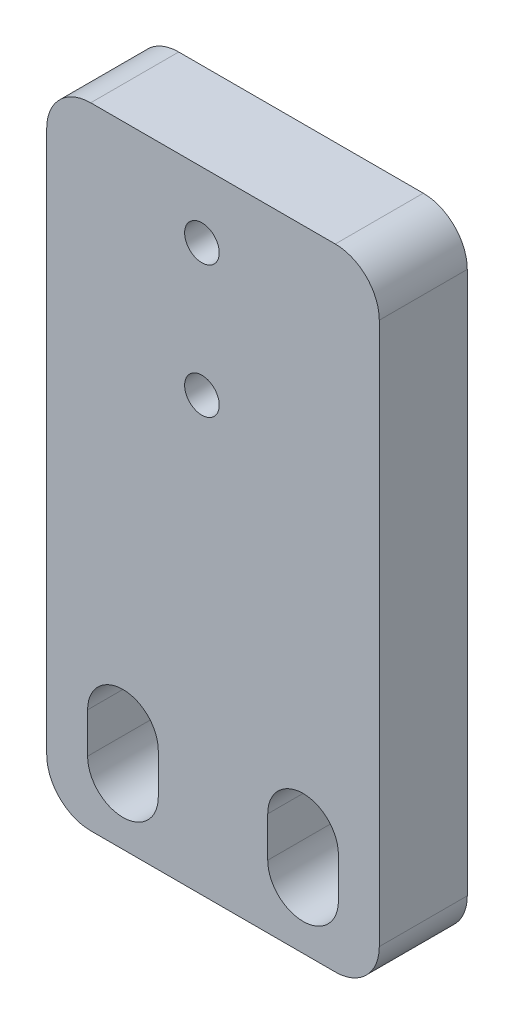
ISO-10303-21;
HEADER;
FILE_DESCRIPTION(('STEP AP214'),'2;1');
FILE_NAME('part.step','',(''),(''),'','','');
FILE_SCHEMA(('AUTOMOTIVE_DESIGN { 1 0 10303 214 1 1 1 1 }'));
ENDSEC;
DATA;
#1=APPLICATION_CONTEXT('core data for automotive mechanical design processes');
#2=APPLICATION_PROTOCOL_DEFINITION('international standard','automotive_design',2000,#1);
#3=PRODUCT_CONTEXT('',#1,'mechanical');
#4=PRODUCT('Part','Part','',(#3));
#5=PRODUCT_RELATED_PRODUCT_CATEGORY('part','',(#4));
#6=PRODUCT_DEFINITION_FORMATION('','',#4);
#7=PRODUCT_DEFINITION_CONTEXT('part definition',#1,'design');
#8=PRODUCT_DEFINITION('design','',#6,#7);
#9=PRODUCT_DEFINITION_SHAPE('','',#8);
#10=(LENGTH_UNIT() NAMED_UNIT(*) SI_UNIT(.MILLI.,.METRE.));
#11=(NAMED_UNIT(*) PLANE_ANGLE_UNIT() SI_UNIT($,.RADIAN.));
#12=(NAMED_UNIT(*) SI_UNIT($,.STERADIAN.) SOLID_ANGLE_UNIT());
#13=UNCERTAINTY_MEASURE_WITH_UNIT(LENGTH_MEASURE(1.E-05),#10,'distance_accuracy_value','');
#14=(GEOMETRIC_REPRESENTATION_CONTEXT(3) GLOBAL_UNCERTAINTY_ASSIGNED_CONTEXT((#13)) GLOBAL_UNIT_ASSIGNED_CONTEXT((#10,
#11,#12)) REPRESENTATION_CONTEXT('',''));
#15=CARTESIAN_POINT('',(0.,0.,0.));
#16=DIRECTION('',(0.,0.,1.));
#17=DIRECTION('',(1.,0.,0.));
#18=AXIS2_PLACEMENT_3D('',#15,#16,#17);
#19=CARTESIAN_POINT('',(203.92561380404,258.97885422312,6.35));
#20=DIRECTION('',(0.,0.,1.));
#21=DIRECTION('',(1.,0.,0.));
#22=AXIS2_PLACEMENT_3D('',#19,#20,#21);
#23=PLANE('',#22);
#24=CARTESIAN_POINT('',(211.95061380176,247.89135422392,6.35));
#25=DIRECTION('',(0.,0.,1.));
#26=DIRECTION('',(1.,0.,0.));
#27=AXIS2_PLACEMENT_3D('',#24,#25,#26);
#28=CIRCLE('',#27,1.24999999936001);
#29=CARTESIAN_POINT('',(213.20061380112,247.89135422392,6.35));
#30=VERTEX_POINT('',#29);
#31=EDGE_CURVE('E173',#30,#30,#28,.T.);
#32=ORIENTED_EDGE('',*,*,#31,.F.);
#33=EDGE_LOOP('',(#32));
#34=FACE_BOUND('',#33,.T.);
#35=DIRECTION('',(0.,1.,0.));
#36=VECTOR('',#35,1.);
#37=CARTESIAN_POINT('',(208.80061380256,224.10385422472,6.35));
#38=LINE('',#37,#36);
#39=CARTESIAN_POINT('',(208.80061380256,221.20385422336,6.35));
#40=VERTEX_POINT('',#39);
#41=CARTESIAN_POINT('',(208.80061380256,224.10385422472,6.35));
#42=VERTEX_POINT('',#41);
#43=EDGE_CURVE('E185',#40,#42,#38,.T.);
#44=ORIENTED_EDGE('',*,*,#43,.F.);
#45=CARTESIAN_POINT('',(206.25061380224,221.20385422336,6.35));
#46=DIRECTION('',(0.,0.,1.));
#47=DIRECTION('',(1.,0.,0.));
#48=AXIS2_PLACEMENT_3D('',#45,#46,#47);
#49=CIRCLE('',#48,2.55000000032);
#50=CARTESIAN_POINT('',(203.70061380192,221.20385422336,6.35));
#51=VERTEX_POINT('',#50);
#52=EDGE_CURVE('E183',#51,#40,#49,.T.);
#53=ORIENTED_EDGE('',*,*,#52,.F.);
#54=DIRECTION('',(0.,-1.,0.));
#55=VECTOR('',#54,1.);
#56=CARTESIAN_POINT('',(203.70061380192,221.20385422336,6.35));
#57=LINE('',#56,#55);
#58=CARTESIAN_POINT('',(203.70061380192,224.10385422472,6.35));
#59=VERTEX_POINT('',#58);
#60=EDGE_CURVE('E191',#59,#51,#57,.T.);
#61=ORIENTED_EDGE('',*,*,#60,.F.);
#62=CARTESIAN_POINT('',(206.25061380224,224.10385422472,6.35));
#63=DIRECTION('',(0.,0.,1.));
#64=DIRECTION('',(1.,0.,0.));
#65=AXIS2_PLACEMENT_3D('',#62,#63,#64);
#66=CIRCLE('',#65,2.55000000032);
#67=EDGE_CURVE('E188',#42,#59,#66,.T.);
#68=ORIENTED_EDGE('',*,*,#67,.F.);
#69=EDGE_LOOP('',(#44,#53,#61,#68));
#70=FACE_BOUND('',#69,.T.);
#71=CARTESIAN_POINT('',(203.92561380404,258.97885422312,6.35));
#72=DIRECTION('',(0.,0.,1.));
#73=DIRECTION('',(1.,0.,0.));
#74=AXIS2_PLACEMENT_3D('',#71,#72,#73);
#75=CIRCLE('',#74,3.175);
#76=CARTESIAN_POINT('',(203.92561380404,262.15385422312,6.35));
#77=VERTEX_POINT('',#76);
#78=CARTESIAN_POINT('',(200.75061380404,258.97885422312,6.35));
#79=VERTEX_POINT('',#78);
#80=EDGE_CURVE('E214',#77,#79,#75,.T.);
#81=ORIENTED_EDGE('',*,*,#80,.T.);
#82=DIRECTION('',(0.,-1.,0.));
#83=VECTOR('',#82,1.);
#84=CARTESIAN_POINT('',(200.75061380404,258.97885422312,6.35));
#85=LINE('',#84,#83);
#86=CARTESIAN_POINT('',(200.75061380404,219.82885422254,6.35));
#87=VERTEX_POINT('',#86);
#88=EDGE_CURVE('E217',#79,#87,#85,.T.);
#89=ORIENTED_EDGE('',*,*,#88,.T.);
#90=CARTESIAN_POINT('',(203.92561380404,219.82885422254,6.35));
#91=DIRECTION('',(0.,0.,1.));
#92=DIRECTION('',(1.,0.,0.));
#93=AXIS2_PLACEMENT_3D('',#90,#91,#92);
#94=CIRCLE('',#93,3.175);
#95=CARTESIAN_POINT('',(203.92561380404,216.65385422254,6.35));
#96=VERTEX_POINT('',#95);
#97=EDGE_CURVE('E220',#87,#96,#94,.T.);
#98=ORIENTED_EDGE('',*,*,#97,.T.);
#99=DIRECTION('',(1.,0.,0.));
#100=VECTOR('',#99,1.);
#101=CARTESIAN_POINT('',(203.92561380404,216.65385422254,6.35));
#102=LINE('',#101,#100);
#103=CARTESIAN_POINT('',(221.57561380242,216.65385422254,6.35));
#104=VERTEX_POINT('',#103);
#105=EDGE_CURVE('E222',#96,#104,#102,.T.);
#106=ORIENTED_EDGE('',*,*,#105,.T.);
#107=CARTESIAN_POINT('',(221.57561380242,219.82885422254,6.35));
#108=DIRECTION('',(0.,0.,1.));
#109=DIRECTION('',(1.,0.,0.));
#110=AXIS2_PLACEMENT_3D('',#107,#108,#109);
#111=CIRCLE('',#110,3.175);
#112=CARTESIAN_POINT('',(224.75061380242,219.82885422254,6.35));
#113=VERTEX_POINT('',#112);
#114=EDGE_CURVE('E224',#104,#113,#111,.T.);
#115=ORIENTED_EDGE('',*,*,#114,.T.);
#116=DIRECTION('',(0.,1.,0.));
#117=VECTOR('',#116,1.);
#118=CARTESIAN_POINT('',(224.75061380242,219.82885422254,6.35));
#119=LINE('',#118,#117);
#120=CARTESIAN_POINT('',(224.75061380242,258.97885422312,6.35));
#121=VERTEX_POINT('',#120);
#122=EDGE_CURVE('E226',#113,#121,#119,.T.);
#123=ORIENTED_EDGE('',*,*,#122,.T.);
#124=CARTESIAN_POINT('',(221.57561380242,258.97885422312,6.35));
#125=DIRECTION('',(0.,0.,1.));
#126=DIRECTION('',(1.,0.,0.));
#127=AXIS2_PLACEMENT_3D('',#124,#125,#126);
#128=CIRCLE('',#127,3.175);
#129=CARTESIAN_POINT('',(221.57561380242,262.15385422312,6.35));
#130=VERTEX_POINT('',#129);
#131=EDGE_CURVE('E228',#121,#130,#128,.T.);
#132=ORIENTED_EDGE('',*,*,#131,.T.);
#133=DIRECTION('',(-1.,0.,0.));
#134=VECTOR('',#133,1.);
#135=CARTESIAN_POINT('',(221.57561380242,262.15385422312,6.35));
#136=LINE('',#135,#134);
#137=EDGE_CURVE('E230',#130,#77,#136,.T.);
#138=ORIENTED_EDGE('',*,*,#137,.T.);
#139=EDGE_LOOP('',(#81,#89,#98,#106,#115,#123,#132,#138));
#140=FACE_BOUND('',#139,.T.);
#141=DIRECTION('',(0.,-1.,0.));
#142=VECTOR('',#141,1.);
#143=CARTESIAN_POINT('',(216.7006138039,224.10385422472,6.35));
#144=LINE('',#143,#142);
#145=CARTESIAN_POINT('',(216.7006138039,224.10385422472,6.35));
#146=VERTEX_POINT('',#145);
#147=CARTESIAN_POINT('',(216.7006138039,221.20385422336,6.35));
#148=VERTEX_POINT('',#147);
#149=EDGE_CURVE('E152',#146,#148,#144,.T.);
#150=ORIENTED_EDGE('',*,*,#149,.F.);
#151=CARTESIAN_POINT('',(219.25061380295,224.10385422472,6.35));
#152=DIRECTION('',(0.,0.,1.));
#153=DIRECTION('',(1.,0.,0.));
#154=AXIS2_PLACEMENT_3D('',#151,#152,#153);
#155=CIRCLE('',#154,2.54999999904999);
#156=CARTESIAN_POINT('',(221.800613802,224.10385422472,6.35));
#157=VERTEX_POINT('',#156);
#158=EDGE_CURVE('E144',#157,#146,#155,.T.);
#159=ORIENTED_EDGE('',*,*,#158,.F.);
#160=DIRECTION('',(0.,1.,0.));
#161=VECTOR('',#160,1.);
#162=CARTESIAN_POINT('',(221.800613802,221.20385422336,6.35));
#163=LINE('',#162,#161);
#164=CARTESIAN_POINT('',(221.800613802,221.20385422336,6.35));
#165=VERTEX_POINT('',#164);
#166=EDGE_CURVE('E167',#165,#157,#163,.T.);
#167=ORIENTED_EDGE('',*,*,#166,.F.);
#168=CARTESIAN_POINT('',(219.25061380295,221.20385422336,6.35));
#169=DIRECTION('',(0.,0.,1.));
#170=DIRECTION('',(1.,0.,0.));
#171=AXIS2_PLACEMENT_3D('',#168,#169,#170);
#172=CIRCLE('',#171,2.54999999904999);
#173=EDGE_CURVE('E165',#148,#165,#172,.T.);
#174=ORIENTED_EDGE('',*,*,#173,.F.);
#175=EDGE_LOOP('',(#150,#159,#167,#174));
#176=FACE_BOUND('',#175,.T.);
#177=CARTESIAN_POINT('',(211.95061380176,257.41635422392,6.35));
#178=DIRECTION('',(0.,0.,1.));
#179=DIRECTION('',(1.,0.,0.));
#180=AXIS2_PLACEMENT_3D('',#177,#178,#179);
#181=CIRCLE('',#180,1.24999999936001);
#182=CARTESIAN_POINT('',(213.20061380112,257.41635422392,6.35));
#183=VERTEX_POINT('',#182);
#184=EDGE_CURVE('E382',#183,#183,#181,.T.);
#185=ORIENTED_EDGE('',*,*,#184,.F.);
#186=EDGE_LOOP('',(#185));
#187=FACE_BOUND('',#186,.T.);
#188=ADVANCED_FACE('F31',(#34,#70,#140,#176,#187),#23,.T.);
#189=CARTESIAN_POINT('',(203.92561380404,258.97885422312,0.));
#190=DIRECTION('',(0.,0.,1.));
#191=DIRECTION('',(1.,0.,0.));
#192=AXIS2_PLACEMENT_3D('',#189,#190,#191);
#193=PLANE('',#192);
#194=CARTESIAN_POINT('',(211.95061380176,247.89135422392,0.));
#195=DIRECTION('',(0.,0.,1.));
#196=DIRECTION('',(1.,0.,0.));
#197=AXIS2_PLACEMENT_3D('',#194,#195,#196);
#198=CIRCLE('',#197,1.24999999936001);
#199=CARTESIAN_POINT('',(213.20061380112,247.89135422392,0.));
#200=VERTEX_POINT('',#199);
#201=EDGE_CURVE('E388',#200,#200,#198,.T.);
#202=ORIENTED_EDGE('',*,*,#201,.T.);
#203=EDGE_LOOP('',(#202));
#204=FACE_BOUND('',#203,.T.);
#205=CARTESIAN_POINT('',(206.25061380224,221.20385422336,0.));
#206=DIRECTION('',(0.,0.,1.));
#207=DIRECTION('',(1.,0.,0.));
#208=AXIS2_PLACEMENT_3D('',#205,#206,#207);
#209=CIRCLE('',#208,2.55000000032);
#210=CARTESIAN_POINT('',(203.70061380192,221.20385422336,0.));
#211=VERTEX_POINT('',#210);
#212=CARTESIAN_POINT('',(208.80061380256,221.20385422336,0.));
#213=VERTEX_POINT('',#212);
#214=EDGE_CURVE('E160',#211,#213,#209,.T.);
#215=ORIENTED_EDGE('',*,*,#214,.T.);
#216=DIRECTION('',(0.,1.,0.));
#217=VECTOR('',#216,1.);
#218=CARTESIAN_POINT('',(208.80061380256,224.10385422472,0.));
#219=LINE('',#218,#217);
#220=CARTESIAN_POINT('',(208.80061380256,224.10385422472,0.));
#221=VERTEX_POINT('',#220);
#222=EDGE_CURVE('E196',#213,#221,#219,.T.);
#223=ORIENTED_EDGE('',*,*,#222,.T.);
#224=CARTESIAN_POINT('',(206.25061380224,224.10385422472,0.));
#225=DIRECTION('',(0.,0.,1.));
#226=DIRECTION('',(1.,0.,0.));
#227=AXIS2_PLACEMENT_3D('',#224,#225,#226);
#228=CIRCLE('',#227,2.55000000032);
#229=CARTESIAN_POINT('',(203.70061380192,224.10385422472,0.));
#230=VERTEX_POINT('',#229);
#231=EDGE_CURVE('E199',#221,#230,#228,.T.);
#232=ORIENTED_EDGE('',*,*,#231,.T.);
#233=DIRECTION('',(0.,-1.,0.));
#234=VECTOR('',#233,1.);
#235=CARTESIAN_POINT('',(203.70061380192,221.20385422336,0.));
#236=LINE('',#235,#234);
#237=EDGE_CURVE('E186',#230,#211,#236,.T.);
#238=ORIENTED_EDGE('',*,*,#237,.T.);
#239=EDGE_LOOP('',(#215,#223,#232,#238));
#240=FACE_BOUND('',#239,.T.);
#241=CARTESIAN_POINT('',(203.92561380404,258.97885422312,0.));
#242=DIRECTION('',(0.,0.,1.));
#243=DIRECTION('',(1.,0.,0.));
#244=AXIS2_PLACEMENT_3D('',#241,#242,#243);
#245=CIRCLE('',#244,3.175);
#246=CARTESIAN_POINT('',(203.92561380404,262.15385422312,0.));
#247=VERTEX_POINT('',#246);
#248=CARTESIAN_POINT('',(200.75061380404,258.97885422312,0.));
#249=VERTEX_POINT('',#248);
#250=EDGE_CURVE('E213',#247,#249,#245,.T.);
#251=ORIENTED_EDGE('',*,*,#250,.F.);
#252=DIRECTION('',(-1.,0.,0.));
#253=VECTOR('',#252,1.);
#254=CARTESIAN_POINT('',(221.57561380242,262.15385422312,0.));
#255=LINE('',#254,#253);
#256=CARTESIAN_POINT('',(221.57561380242,262.15385422312,0.));
#257=VERTEX_POINT('',#256);
#258=EDGE_CURVE('E218',#257,#247,#255,.T.);
#259=ORIENTED_EDGE('',*,*,#258,.F.);
#260=CARTESIAN_POINT('',(221.57561380242,258.97885422312,0.));
#261=DIRECTION('',(0.,0.,1.));
#262=DIRECTION('',(1.,0.,0.));
#263=AXIS2_PLACEMENT_3D('',#260,#261,#262);
#264=CIRCLE('',#263,3.175);
#265=CARTESIAN_POINT('',(224.75061380242,258.97885422312,0.));
#266=VERTEX_POINT('',#265);
#267=EDGE_CURVE('E245',#266,#257,#264,.T.);
#268=ORIENTED_EDGE('',*,*,#267,.F.);
#269=DIRECTION('',(0.,1.,0.));
#270=VECTOR('',#269,1.);
#271=CARTESIAN_POINT('',(224.75061380242,219.82885422254,0.));
#272=LINE('',#271,#270);
#273=CARTESIAN_POINT('',(224.75061380242,219.82885422254,0.));
#274=VERTEX_POINT('',#273);
#275=EDGE_CURVE('E243',#274,#266,#272,.T.);
#276=ORIENTED_EDGE('',*,*,#275,.F.);
#277=CARTESIAN_POINT('',(221.57561380242,219.82885422254,0.));
#278=DIRECTION('',(0.,0.,1.));
#279=DIRECTION('',(1.,0.,0.));
#280=AXIS2_PLACEMENT_3D('',#277,#278,#279);
#281=CIRCLE('',#280,3.175);
#282=CARTESIAN_POINT('',(221.57561380242,216.65385422254,0.));
#283=VERTEX_POINT('',#282);
#284=EDGE_CURVE('E241',#283,#274,#281,.T.);
#285=ORIENTED_EDGE('',*,*,#284,.F.);
#286=DIRECTION('',(1.,0.,0.));
#287=VECTOR('',#286,1.);
#288=CARTESIAN_POINT('',(203.92561380404,216.65385422254,0.));
#289=LINE('',#288,#287);
#290=CARTESIAN_POINT('',(203.92561380404,216.65385422254,0.));
#291=VERTEX_POINT('',#290);
#292=EDGE_CURVE('E239',#291,#283,#289,.T.);
#293=ORIENTED_EDGE('',*,*,#292,.F.);
#294=CARTESIAN_POINT('',(203.92561380404,219.82885422254,0.));
#295=DIRECTION('',(0.,0.,1.));
#296=DIRECTION('',(1.,0.,0.));
#297=AXIS2_PLACEMENT_3D('',#294,#295,#296);
#298=CIRCLE('',#297,3.175);
#299=CARTESIAN_POINT('',(200.75061380404,219.82885422254,0.));
#300=VERTEX_POINT('',#299);
#301=EDGE_CURVE('E237',#300,#291,#298,.T.);
#302=ORIENTED_EDGE('',*,*,#301,.F.);
#303=DIRECTION('',(0.,-1.,0.));
#304=VECTOR('',#303,1.);
#305=CARTESIAN_POINT('',(200.75061380404,258.97885422312,0.));
#306=LINE('',#305,#304);
#307=EDGE_CURVE('E235',#249,#300,#306,.T.);
#308=ORIENTED_EDGE('',*,*,#307,.F.);
#309=EDGE_LOOP('',(#251,#259,#268,#276,#285,#293,#302,#308));
#310=FACE_BOUND('',#309,.T.);
#311=CARTESIAN_POINT('',(219.25061380295,224.10385422472,0.));
#312=DIRECTION('',(0.,0.,1.));
#313=DIRECTION('',(1.,0.,0.));
#314=AXIS2_PLACEMENT_3D('',#311,#312,#313);
#315=CIRCLE('',#314,2.54999999904999);
#316=CARTESIAN_POINT('',(221.800613802,224.10385422472,0.));
#317=VERTEX_POINT('',#316);
#318=CARTESIAN_POINT('',(216.7006138039,224.10385422472,0.));
#319=VERTEX_POINT('',#318);
#320=EDGE_CURVE('E54',#317,#319,#315,.T.);
#321=ORIENTED_EDGE('',*,*,#320,.T.);
#322=DIRECTION('',(0.,-1.,0.));
#323=VECTOR('',#322,1.);
#324=CARTESIAN_POINT('',(216.7006138039,224.10385422472,0.));
#325=LINE('',#324,#323);
#326=CARTESIAN_POINT('',(216.7006138039,221.20385422336,0.));
#327=VERTEX_POINT('',#326);
#328=EDGE_CURVE('E159',#319,#327,#325,.T.);
#329=ORIENTED_EDGE('',*,*,#328,.T.);
#330=CARTESIAN_POINT('',(219.25061380295,221.20385422336,0.));
#331=DIRECTION('',(0.,0.,1.));
#332=DIRECTION('',(1.,0.,0.));
#333=AXIS2_PLACEMENT_3D('',#330,#331,#332);
#334=CIRCLE('',#333,2.54999999904999);
#335=CARTESIAN_POINT('',(221.800613802,221.20385422336,0.));
#336=VERTEX_POINT('',#335);
#337=EDGE_CURVE('E175',#327,#336,#334,.T.);
#338=ORIENTED_EDGE('',*,*,#337,.T.);
#339=DIRECTION('',(0.,1.,0.));
#340=VECTOR('',#339,1.);
#341=CARTESIAN_POINT('',(221.800613802,221.20385422336,0.));
#342=LINE('',#341,#340);
#343=EDGE_CURVE('E153',#336,#317,#342,.T.);
#344=ORIENTED_EDGE('',*,*,#343,.T.);
#345=EDGE_LOOP('',(#321,#329,#338,#344));
#346=FACE_BOUND('',#345,.T.);
#347=CARTESIAN_POINT('',(211.95061380176,257.41635422392,0.));
#348=DIRECTION('',(0.,0.,1.));
#349=DIRECTION('',(1.,0.,0.));
#350=AXIS2_PLACEMENT_3D('',#347,#348,#349);
#351=CIRCLE('',#350,1.24999999936001);
#352=CARTESIAN_POINT('',(213.20061380112,257.41635422392,0.));
#353=VERTEX_POINT('',#352);
#354=EDGE_CURVE('E385',#353,#353,#351,.T.);
#355=ORIENTED_EDGE('',*,*,#354,.T.);
#356=EDGE_LOOP('',(#355));
#357=FACE_BOUND('',#356,.T.);
#358=ADVANCED_FACE('F275',(#204,#240,#310,#346,#357),#193,.F.);
#359=CARTESIAN_POINT('',(203.92561380404,258.97885422312,6.35));
#360=DIRECTION('',(0.,0.,-1.));
#361=DIRECTION('',(-1.,0.,0.));
#362=AXIS2_PLACEMENT_3D('',#359,#360,#361);
#363=CYLINDRICAL_SURFACE('',#362,3.175);
#364=ORIENTED_EDGE('',*,*,#250,.T.);
#365=DIRECTION('',(0.,0.,-1.));
#366=VECTOR('',#365,1.);
#367=CARTESIAN_POINT('',(200.75061380404,258.97885422312,6.35));
#368=LINE('',#367,#366);
#369=EDGE_CURVE('E11',#79,#249,#368,.T.);
#370=ORIENTED_EDGE('',*,*,#369,.F.);
#371=ORIENTED_EDGE('',*,*,#80,.F.);
#372=DIRECTION('',(0.,0.,-1.));
#373=VECTOR('',#372,1.);
#374=CARTESIAN_POINT('',(203.92561380404,262.15385422312,6.35));
#375=LINE('',#374,#373);
#376=EDGE_CURVE('E232',#77,#247,#375,.T.);
#377=ORIENTED_EDGE('',*,*,#376,.T.);
#378=EDGE_LOOP('',(#364,#370,#371,#377));
#379=FACE_BOUND('',#378,.T.);
#380=ADVANCED_FACE('F33',(#379),#363,.T.);
#381=CARTESIAN_POINT('',(200.75061380404,258.97885422312,6.35));
#382=DIRECTION('',(1.,0.,0.));
#383=DIRECTION('',(0.,0.,-1.));
#384=AXIS2_PLACEMENT_3D('',#381,#382,#383);
#385=PLANE('',#384);
#386=ORIENTED_EDGE('',*,*,#307,.T.);
#387=DIRECTION('',(0.,0.,-1.));
#388=VECTOR('',#387,1.);
#389=CARTESIAN_POINT('',(200.75061380404,219.82885422254,6.35));
#390=LINE('',#389,#388);
#391=EDGE_CURVE('E39',#87,#300,#390,.T.);
#392=ORIENTED_EDGE('',*,*,#391,.F.);
#393=ORIENTED_EDGE('',*,*,#88,.F.);
#394=ORIENTED_EDGE('',*,*,#369,.T.);
#395=EDGE_LOOP('',(#386,#392,#393,#394));
#396=FACE_BOUND('',#395,.T.);
#397=ADVANCED_FACE('F292',(#396),#385,.F.);
#398=CARTESIAN_POINT('',(203.92561380404,219.82885422254,6.35));
#399=DIRECTION('',(0.,0.,-1.));
#400=DIRECTION('',(-1.,0.,0.));
#401=AXIS2_PLACEMENT_3D('',#398,#399,#400);
#402=CYLINDRICAL_SURFACE('',#401,3.175);
#403=ORIENTED_EDGE('',*,*,#301,.T.);
#404=DIRECTION('',(0.,0.,-1.));
#405=VECTOR('',#404,1.);
#406=CARTESIAN_POINT('',(203.92561380404,216.65385422254,6.35));
#407=LINE('',#406,#405);
#408=EDGE_CURVE('E262',#96,#291,#407,.T.);
#409=ORIENTED_EDGE('',*,*,#408,.F.);
#410=ORIENTED_EDGE('',*,*,#97,.F.);
#411=ORIENTED_EDGE('',*,*,#391,.T.);
#412=EDGE_LOOP('',(#403,#409,#410,#411));
#413=FACE_BOUND('',#412,.T.);
#414=ADVANCED_FACE('F269',(#413),#402,.T.);
#415=CARTESIAN_POINT('',(203.92561380404,216.65385422254,6.35));
#416=DIRECTION('',(0.,1.,0.));
#417=DIRECTION('',(0.,0.,1.));
#418=AXIS2_PLACEMENT_3D('',#415,#416,#417);
#419=PLANE('',#418);
#420=ORIENTED_EDGE('',*,*,#292,.T.);
#421=DIRECTION('',(0.,0.,-1.));
#422=VECTOR('',#421,1.);
#423=CARTESIAN_POINT('',(221.57561380242,216.65385422254,6.35));
#424=LINE('',#423,#422);
#425=EDGE_CURVE('E259',#104,#283,#424,.T.);
#426=ORIENTED_EDGE('',*,*,#425,.F.);
#427=ORIENTED_EDGE('',*,*,#105,.F.);
#428=ORIENTED_EDGE('',*,*,#408,.T.);
#429=EDGE_LOOP('',(#420,#426,#427,#428));
#430=FACE_BOUND('',#429,.T.);
#431=ADVANCED_FACE('F281',(#430),#419,.F.);
#432=CARTESIAN_POINT('',(221.57561380242,219.82885422254,6.35));
#433=DIRECTION('',(0.,0.,-1.));
#434=DIRECTION('',(-1.,0.,0.));
#435=AXIS2_PLACEMENT_3D('',#432,#433,#434);
#436=CYLINDRICAL_SURFACE('',#435,3.175);
#437=ORIENTED_EDGE('',*,*,#284,.T.);
#438=DIRECTION('',(0.,0.,-1.));
#439=VECTOR('',#438,1.);
#440=CARTESIAN_POINT('',(224.75061380242,219.82885422254,6.35));
#441=LINE('',#440,#439);
#442=EDGE_CURVE('E256',#113,#274,#441,.T.);
#443=ORIENTED_EDGE('',*,*,#442,.F.);
#444=ORIENTED_EDGE('',*,*,#114,.F.);
#445=ORIENTED_EDGE('',*,*,#425,.T.);
#446=EDGE_LOOP('',(#437,#443,#444,#445));
#447=FACE_BOUND('',#446,.T.);
#448=ADVANCED_FACE('F285',(#447),#436,.T.);
#449=CARTESIAN_POINT('',(224.75061380242,219.82885422254,6.35));
#450=DIRECTION('',(-1.,0.,0.));
#451=DIRECTION('',(0.,0.,1.));
#452=AXIS2_PLACEMENT_3D('',#449,#450,#451);
#453=PLANE('',#452);
#454=ORIENTED_EDGE('',*,*,#275,.T.);
#455=DIRECTION('',(0.,0.,-1.));
#456=VECTOR('',#455,1.);
#457=CARTESIAN_POINT('',(224.75061380242,258.97885422312,6.35));
#458=LINE('',#457,#456);
#459=EDGE_CURVE('E253',#121,#266,#458,.T.);
#460=ORIENTED_EDGE('',*,*,#459,.F.);
#461=ORIENTED_EDGE('',*,*,#122,.F.);
#462=ORIENTED_EDGE('',*,*,#442,.T.);
#463=EDGE_LOOP('',(#454,#460,#461,#462));
#464=FACE_BOUND('',#463,.T.);
#465=ADVANCED_FACE('F305',(#464),#453,.F.);
#466=CARTESIAN_POINT('',(221.57561380242,258.97885422312,6.35));
#467=DIRECTION('',(0.,0.,-1.));
#468=DIRECTION('',(-1.,0.,0.));
#469=AXIS2_PLACEMENT_3D('',#466,#467,#468);
#470=CYLINDRICAL_SURFACE('',#469,3.175);
#471=ORIENTED_EDGE('',*,*,#267,.T.);
#472=DIRECTION('',(0.,0.,-1.));
#473=VECTOR('',#472,1.);
#474=CARTESIAN_POINT('',(221.57561380242,262.15385422312,6.35));
#475=LINE('',#474,#473);
#476=EDGE_CURVE('E250',#130,#257,#475,.T.);
#477=ORIENTED_EDGE('',*,*,#476,.F.);
#478=ORIENTED_EDGE('',*,*,#131,.F.);
#479=ORIENTED_EDGE('',*,*,#459,.T.);
#480=EDGE_LOOP('',(#471,#477,#478,#479));
#481=FACE_BOUND('',#480,.T.);
#482=ADVANCED_FACE('F303',(#481),#470,.T.);
#483=CARTESIAN_POINT('',(221.57561380242,262.15385422312,6.35));
#484=DIRECTION('',(0.,-1.,0.));
#485=DIRECTION('',(0.,0.,-1.));
#486=AXIS2_PLACEMENT_3D('',#483,#484,#485);
#487=PLANE('',#486);
#488=ORIENTED_EDGE('',*,*,#258,.T.);
#489=ORIENTED_EDGE('',*,*,#376,.F.);
#490=ORIENTED_EDGE('',*,*,#137,.F.);
#491=ORIENTED_EDGE('',*,*,#476,.T.);
#492=EDGE_LOOP('',(#488,#489,#490,#491));
#493=FACE_BOUND('',#492,.T.);
#494=ADVANCED_FACE('F298',(#493),#487,.F.);
#495=CARTESIAN_POINT('',(206.25061380224,221.20385422336,6.35));
#496=DIRECTION('',(0.,0.,-1.));
#497=DIRECTION('',(-1.,0.,0.));
#498=AXIS2_PLACEMENT_3D('',#495,#496,#497);
#499=CYLINDRICAL_SURFACE('',#498,2.55000000032);
#500=ORIENTED_EDGE('',*,*,#214,.F.);
#501=DIRECTION('',(0.,0.,-1.));
#502=VECTOR('',#501,1.);
#503=CARTESIAN_POINT('',(203.70061380192,221.20385422336,6.35));
#504=LINE('',#503,#502);
#505=EDGE_CURVE('E193',#51,#211,#504,.T.);
#506=ORIENTED_EDGE('',*,*,#505,.F.);
#507=ORIENTED_EDGE('',*,*,#52,.T.);
#508=DIRECTION('',(0.,0.,-1.));
#509=VECTOR('',#508,1.);
#510=CARTESIAN_POINT('',(208.80061380256,221.20385422336,6.35));
#511=LINE('',#510,#509);
#512=EDGE_CURVE('E210',#40,#213,#511,.T.);
#513=ORIENTED_EDGE('',*,*,#512,.T.);
#514=EDGE_LOOP('',(#500,#506,#507,#513));
#515=FACE_BOUND('',#514,.T.);
#516=ADVANCED_FACE('F325',(#515),#499,.F.);
#517=CARTESIAN_POINT('',(208.80061380256,224.10385422472,6.35));
#518=DIRECTION('',(-1.,0.,0.));
#519=DIRECTION('',(0.,0.,1.));
#520=AXIS2_PLACEMENT_3D('',#517,#518,#519);
#521=PLANE('',#520);
#522=ORIENTED_EDGE('',*,*,#222,.F.);
#523=ORIENTED_EDGE('',*,*,#512,.F.);
#524=ORIENTED_EDGE('',*,*,#43,.T.);
#525=DIRECTION('',(0.,0.,-1.));
#526=VECTOR('',#525,1.);
#527=CARTESIAN_POINT('',(208.80061380256,224.10385422472,6.35));
#528=LINE('',#527,#526);
#529=EDGE_CURVE('E208',#42,#221,#528,.T.);
#530=ORIENTED_EDGE('',*,*,#529,.T.);
#531=EDGE_LOOP('',(#522,#523,#524,#530));
#532=FACE_BOUND('',#531,.T.);
#533=ADVANCED_FACE('F332',(#532),#521,.T.);
#534=CARTESIAN_POINT('',(206.25061380224,224.10385422472,6.35));
#535=DIRECTION('',(0.,0.,-1.));
#536=DIRECTION('',(-1.,0.,0.));
#537=AXIS2_PLACEMENT_3D('',#534,#535,#536);
#538=CYLINDRICAL_SURFACE('',#537,2.55000000032);
#539=ORIENTED_EDGE('',*,*,#231,.F.);
#540=ORIENTED_EDGE('',*,*,#529,.F.);
#541=ORIENTED_EDGE('',*,*,#67,.T.);
#542=DIRECTION('',(0.,0.,-1.));
#543=VECTOR('',#542,1.);
#544=CARTESIAN_POINT('',(203.70061380192,224.10385422472,6.35));
#545=LINE('',#544,#543);
#546=EDGE_CURVE('E206',#59,#230,#545,.T.);
#547=ORIENTED_EDGE('',*,*,#546,.T.);
#548=EDGE_LOOP('',(#539,#540,#541,#547));
#549=FACE_BOUND('',#548,.T.);
#550=ADVANCED_FACE('F337',(#549),#538,.F.);
#551=CARTESIAN_POINT('',(203.70061380192,221.20385422336,6.35));
#552=DIRECTION('',(1.,0.,0.));
#553=DIRECTION('',(0.,0.,-1.));
#554=AXIS2_PLACEMENT_3D('',#551,#552,#553);
#555=PLANE('',#554);
#556=ORIENTED_EDGE('',*,*,#237,.F.);
#557=ORIENTED_EDGE('',*,*,#546,.F.);
#558=ORIENTED_EDGE('',*,*,#60,.T.);
#559=ORIENTED_EDGE('',*,*,#505,.T.);
#560=EDGE_LOOP('',(#556,#557,#558,#559));
#561=FACE_BOUND('',#560,.T.);
#562=ADVANCED_FACE('F345',(#561),#555,.T.);
#563=CARTESIAN_POINT('',(219.25061380295,224.10385422472,6.35));
#564=DIRECTION('',(0.,0.,-1.));
#565=DIRECTION('',(-1.,0.,0.));
#566=AXIS2_PLACEMENT_3D('',#563,#564,#565);
#567=CYLINDRICAL_SURFACE('',#566,2.54999999904999);
#568=ORIENTED_EDGE('',*,*,#320,.F.);
#569=DIRECTION('',(0.,0.,-1.));
#570=VECTOR('',#569,1.);
#571=CARTESIAN_POINT('',(221.800613802,224.10385422472,6.35));
#572=LINE('',#571,#570);
#573=EDGE_CURVE('E148',#157,#317,#572,.T.);
#574=ORIENTED_EDGE('',*,*,#573,.F.);
#575=ORIENTED_EDGE('',*,*,#158,.T.);
#576=DIRECTION('',(0.,0.,-1.));
#577=VECTOR('',#576,1.);
#578=CARTESIAN_POINT('',(216.7006138039,224.10385422472,6.35));
#579=LINE('',#578,#577);
#580=EDGE_CURVE('E147',#146,#319,#579,.T.);
#581=ORIENTED_EDGE('',*,*,#580,.T.);
#582=EDGE_LOOP('',(#568,#574,#575,#581));
#583=FACE_BOUND('',#582,.T.);
#584=ADVANCED_FACE('F146',(#583),#567,.F.);
#585=CARTESIAN_POINT('',(216.7006138039,224.10385422472,6.35));
#586=DIRECTION('',(1.,0.,0.));
#587=DIRECTION('',(0.,0.,-1.));
#588=AXIS2_PLACEMENT_3D('',#585,#586,#587);
#589=PLANE('',#588);
#590=ORIENTED_EDGE('',*,*,#328,.F.);
#591=ORIENTED_EDGE('',*,*,#580,.F.);
#592=ORIENTED_EDGE('',*,*,#149,.T.);
#593=DIRECTION('',(0.,0.,-1.));
#594=VECTOR('',#593,1.);
#595=CARTESIAN_POINT('',(216.7006138039,221.20385422336,6.35));
#596=LINE('',#595,#594);
#597=EDGE_CURVE('E161',#148,#327,#596,.T.);
#598=ORIENTED_EDGE('',*,*,#597,.T.);
#599=EDGE_LOOP('',(#590,#591,#592,#598));
#600=FACE_BOUND('',#599,.T.);
#601=ADVANCED_FACE('F156',(#600),#589,.T.);
#602=CARTESIAN_POINT('',(219.25061380295,221.20385422336,6.35));
#603=DIRECTION('',(0.,0.,-1.));
#604=DIRECTION('',(-1.,0.,0.));
#605=AXIS2_PLACEMENT_3D('',#602,#603,#604);
#606=CYLINDRICAL_SURFACE('',#605,2.54999999904999);
#607=ORIENTED_EDGE('',*,*,#337,.F.);
#608=ORIENTED_EDGE('',*,*,#597,.F.);
#609=ORIENTED_EDGE('',*,*,#173,.T.);
#610=DIRECTION('',(0.,0.,-1.));
#611=VECTOR('',#610,1.);
#612=CARTESIAN_POINT('',(221.800613802,221.20385422336,6.35));
#613=LINE('',#612,#611);
#614=EDGE_CURVE('E46',#165,#336,#613,.T.);
#615=ORIENTED_EDGE('',*,*,#614,.T.);
#616=EDGE_LOOP('',(#607,#608,#609,#615));
#617=FACE_BOUND('',#616,.T.);
#618=ADVANCED_FACE('F363',(#617),#606,.F.);
#619=CARTESIAN_POINT('',(221.800613802,221.20385422336,6.35));
#620=DIRECTION('',(-1.,0.,0.));
#621=DIRECTION('',(0.,0.,1.));
#622=AXIS2_PLACEMENT_3D('',#619,#620,#621);
#623=PLANE('',#622);
#624=ORIENTED_EDGE('',*,*,#343,.F.);
#625=ORIENTED_EDGE('',*,*,#614,.F.);
#626=ORIENTED_EDGE('',*,*,#166,.T.);
#627=ORIENTED_EDGE('',*,*,#573,.T.);
#628=EDGE_LOOP('',(#624,#625,#626,#627));
#629=FACE_BOUND('',#628,.T.);
#630=ADVANCED_FACE('F366',(#629),#623,.T.);
#631=CARTESIAN_POINT('',(211.95061380176,247.89135422392,6.35));
#632=DIRECTION('',(0.,0.,-1.));
#633=DIRECTION('',(-1.,0.,0.));
#634=AXIS2_PLACEMENT_3D('',#631,#632,#633);
#635=CYLINDRICAL_SURFACE('',#634,1.24999999936001);
#636=ORIENTED_EDGE('',*,*,#31,.T.);
#637=EDGE_LOOP('',(#636));
#638=FACE_BOUND('',#637,.T.);
#639=ORIENTED_EDGE('',*,*,#201,.F.);
#640=EDGE_LOOP('',(#639));
#641=FACE_BOUND('',#640,.T.);
#642=ADVANCED_FACE('F370',(#638,#641),#635,.F.);
#643=CARTESIAN_POINT('',(211.95061380176,257.41635422392,6.35));
#644=DIRECTION('',(0.,0.,-1.));
#645=DIRECTION('',(-1.,0.,0.));
#646=AXIS2_PLACEMENT_3D('',#643,#644,#645);
#647=CYLINDRICAL_SURFACE('',#646,1.24999999936001);
#648=ORIENTED_EDGE('',*,*,#184,.T.);
#649=EDGE_LOOP('',(#648));
#650=FACE_BOUND('',#649,.T.);
#651=ORIENTED_EDGE('',*,*,#354,.F.);
#652=EDGE_LOOP('',(#651));
#653=FACE_BOUND('',#652,.T.);
#654=ADVANCED_FACE('F373',(#650,#653),#647,.F.);
#655=CLOSED_SHELL('',(#188,#358,#380,#397,#414,#431,#448,#465,#482,#494,#516,#533,#550,#562,
#584,#601,#618,#630,#642,#654));
#656=MANIFOLD_SOLID_BREP('B2',#655);
#657=ADVANCED_BREP_SHAPE_REPRESENTATION('',(#18,#656),#14);
#658=SHAPE_DEFINITION_REPRESENTATION(#9,#657);
ENDSEC;
END-ISO-10303-21;
